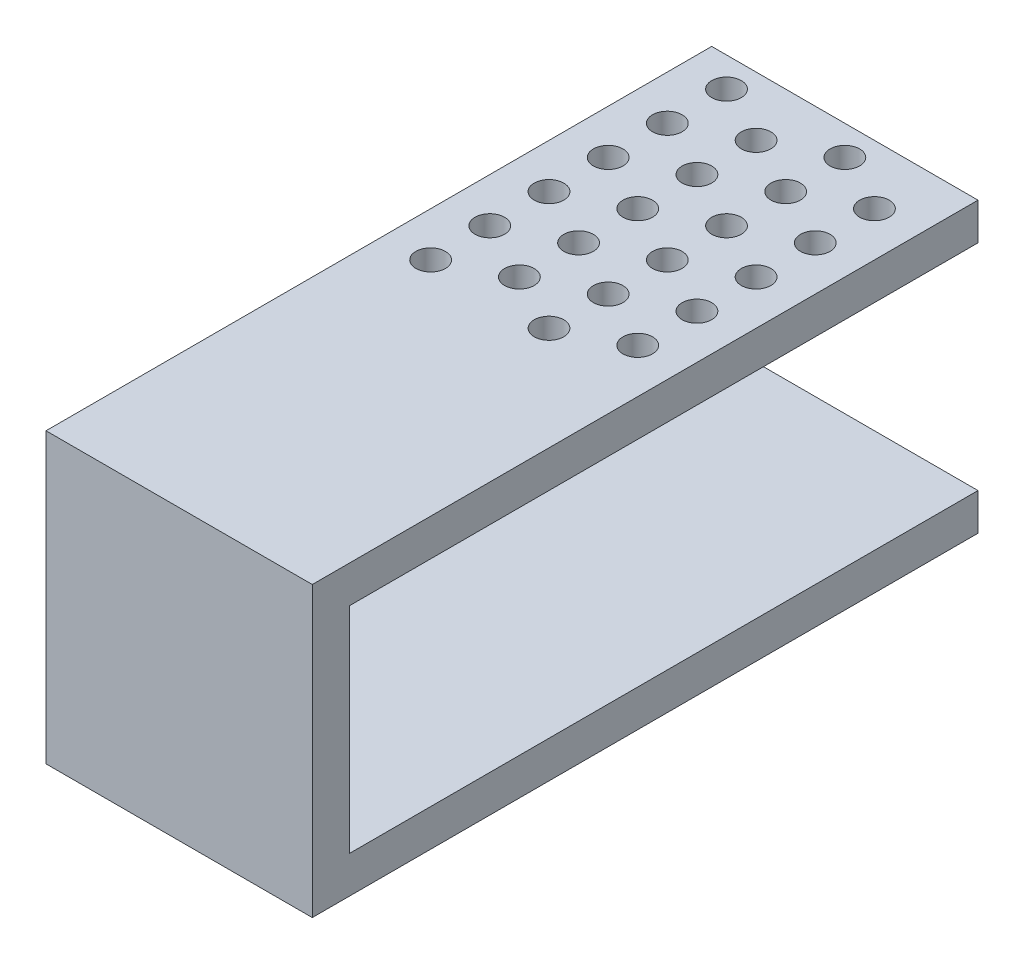
ISO-10303-21;
HEADER;
FILE_DESCRIPTION(('STEP AP214'),'2;1');
FILE_NAME('part.step','',(''),(''),'','','');
FILE_SCHEMA(('AUTOMOTIVE_DESIGN { 1 0 10303 214 1 1 1 1 }'));
ENDSEC;
DATA;
#1=APPLICATION_CONTEXT('core data for automotive mechanical design processes');
#2=APPLICATION_PROTOCOL_DEFINITION('international standard','automotive_design',2000,#1);
#3=PRODUCT_CONTEXT('',#1,'mechanical');
#4=PRODUCT('Part','Part','',(#3));
#5=PRODUCT_RELATED_PRODUCT_CATEGORY('part','',(#4));
#6=PRODUCT_DEFINITION_FORMATION('','',#4);
#7=PRODUCT_DEFINITION_CONTEXT('part definition',#1,'design');
#8=PRODUCT_DEFINITION('design','',#6,#7);
#9=PRODUCT_DEFINITION_SHAPE('','',#8);
#10=(LENGTH_UNIT() NAMED_UNIT(*) SI_UNIT(.MILLI.,.METRE.));
#11=(NAMED_UNIT(*) PLANE_ANGLE_UNIT() SI_UNIT($,.RADIAN.));
#12=(NAMED_UNIT(*) SI_UNIT($,.STERADIAN.) SOLID_ANGLE_UNIT());
#13=UNCERTAINTY_MEASURE_WITH_UNIT(LENGTH_MEASURE(1.E-05),#10,'distance_accuracy_value','');
#14=(GEOMETRIC_REPRESENTATION_CONTEXT(3) GLOBAL_UNCERTAINTY_ASSIGNED_CONTEXT((#13)) GLOBAL_UNIT_ASSIGNED_CONTEXT((#10,
#11,#12)) REPRESENTATION_CONTEXT('',''));
#15=CARTESIAN_POINT('',(0.,0.,0.));
#16=DIRECTION('',(0.,0.,1.));
#17=DIRECTION('',(1.,0.,0.));
#18=AXIS2_PLACEMENT_3D('',#15,#16,#17);
#19=CARTESIAN_POINT('',(-2.,-17.,26.5));
#20=DIRECTION('',(0.,0.,1.));
#21=DIRECTION('',(1.,0.,0.));
#22=AXIS2_PLACEMENT_3D('',#19,#20,#21);
#23=PLANE('',#22);
#24=DIRECTION('',(1.,0.,0.));
#25=VECTOR('',#24,1.);
#26=CARTESIAN_POINT('',(-2.,-14.5,26.5));
#27=LINE('',#26,#25);
#28=CARTESIAN_POINT('',(-20.,-14.5,26.5));
#29=VERTEX_POINT('',#28);
#30=CARTESIAN_POINT('',(-2.,-14.5,26.5));
#31=VERTEX_POINT('',#30);
#32=EDGE_CURVE('E257',#29,#31,#27,.T.);
#33=ORIENTED_EDGE('',*,*,#32,.F.);
#34=DIRECTION('',(0.,1.,0.));
#35=VECTOR('',#34,1.);
#36=CARTESIAN_POINT('',(-20.,-17.,26.5));
#37=LINE('',#36,#35);
#38=CARTESIAN_POINT('',(-20.,0.,26.5));
#39=VERTEX_POINT('',#38);
#40=EDGE_CURVE('E50',#29,#39,#37,.T.);
#41=ORIENTED_EDGE('',*,*,#40,.T.);
#42=DIRECTION('',(1.,0.,0.));
#43=VECTOR('',#42,1.);
#44=CARTESIAN_POINT('',(-2.,0.,26.5));
#45=LINE('',#44,#43);
#46=CARTESIAN_POINT('',(-2.,0.,26.5));
#47=VERTEX_POINT('',#46);
#48=EDGE_CURVE('E87',#39,#47,#45,.T.);
#49=ORIENTED_EDGE('',*,*,#48,.T.);
#50=DIRECTION('',(0.,1.,0.));
#51=VECTOR('',#50,1.);
#52=CARTESIAN_POINT('',(-2.,-17.,26.5));
#53=LINE('',#52,#51);
#54=EDGE_CURVE('E237',#31,#47,#53,.T.);
#55=ORIENTED_EDGE('',*,*,#54,.F.);
#56=EDGE_LOOP('',(#33,#41,#49,#55));
#57=FACE_BOUND('',#56,.T.);
#58=ADVANCED_FACE('F35',(#57),#23,.F.);
#59=CARTESIAN_POINT('',(0.,0.,0.));
#60=DIRECTION('',(0.,1.,0.));
#61=DIRECTION('',(0.,0.,1.));
#62=AXIS2_PLACEMENT_3D('',#59,#60,#61);
#63=PLANE('',#62);
#64=CARTESIAN_POINT('',(-5.,0.,-12.));
#65=DIRECTION('',(0.,1.,0.));
#66=DIRECTION('',(0.,0.,1.));
#67=AXIS2_PLACEMENT_3D('',#64,#65,#66);
#68=CIRCLE('',#67,1.);
#69=CARTESIAN_POINT('',(-5.,0.,-11.));
#70=VERTEX_POINT('',#69);
#71=EDGE_CURVE('E222',#70,#70,#68,.T.);
#72=ORIENTED_EDGE('',*,*,#71,.T.);
#73=EDGE_LOOP('',(#72));
#74=FACE_BOUND('',#73,.T.);
#75=CARTESIAN_POINT('',(-5.,0.,-8.));
#76=DIRECTION('',(0.,1.,0.));
#77=DIRECTION('',(0.,0.,1.));
#78=AXIS2_PLACEMENT_3D('',#75,#76,#77);
#79=CIRCLE('',#78,1.);
#80=CARTESIAN_POINT('',(-5.,0.,-7.));
#81=VERTEX_POINT('',#80);
#82=EDGE_CURVE('E216',#81,#81,#79,.T.);
#83=ORIENTED_EDGE('',*,*,#82,.T.);
#84=EDGE_LOOP('',(#83));
#85=FACE_BOUND('',#84,.T.);
#86=CARTESIAN_POINT('',(-5.,0.,-4.));
#87=DIRECTION('',(0.,1.,0.));
#88=DIRECTION('',(0.,0.,1.));
#89=AXIS2_PLACEMENT_3D('',#86,#87,#88);
#90=CIRCLE('',#89,1.);
#91=CARTESIAN_POINT('',(-5.,0.,-3.));
#92=VERTEX_POINT('',#91);
#93=EDGE_CURVE('E210',#92,#92,#90,.T.);
#94=ORIENTED_EDGE('',*,*,#93,.T.);
#95=EDGE_LOOP('',(#94));
#96=FACE_BOUND('',#95,.T.);
#97=CARTESIAN_POINT('',(-5.,0.,0.));
#98=DIRECTION('',(0.,1.,0.));
#99=DIRECTION('',(0.,0.,1.));
#100=AXIS2_PLACEMENT_3D('',#97,#98,#99);
#101=CIRCLE('',#100,1.);
#102=CARTESIAN_POINT('',(-5.,0.,1.));
#103=VERTEX_POINT('',#102);
#104=EDGE_CURVE('E204',#103,#103,#101,.T.);
#105=ORIENTED_EDGE('',*,*,#104,.T.);
#106=EDGE_LOOP('',(#105));
#107=FACE_BOUND('',#106,.T.);
#108=CARTESIAN_POINT('',(-5.,0.,4.));
#109=DIRECTION('',(0.,1.,0.));
#110=DIRECTION('',(0.,0.,1.));
#111=AXIS2_PLACEMENT_3D('',#108,#109,#110);
#112=CIRCLE('',#111,1.);
#113=CARTESIAN_POINT('',(-5.,0.,5.));
#114=VERTEX_POINT('',#113);
#115=EDGE_CURVE('E198',#114,#114,#112,.T.);
#116=ORIENTED_EDGE('',*,*,#115,.T.);
#117=EDGE_LOOP('',(#116));
#118=FACE_BOUND('',#117,.T.);
#119=CARTESIAN_POINT('',(-9.,0.,-14.));
#120=DIRECTION('',(0.,1.,0.));
#121=DIRECTION('',(0.,0.,1.));
#122=AXIS2_PLACEMENT_3D('',#119,#120,#121);
#123=CIRCLE('',#122,1.);
#124=CARTESIAN_POINT('',(-9.,0.,-13.));
#125=VERTEX_POINT('',#124);
#126=EDGE_CURVE('E192',#125,#125,#123,.T.);
#127=ORIENTED_EDGE('',*,*,#126,.T.);
#128=EDGE_LOOP('',(#127));
#129=FACE_BOUND('',#128,.T.);
#130=CARTESIAN_POINT('',(-9.,0.,-10.));
#131=DIRECTION('',(0.,1.,0.));
#132=DIRECTION('',(0.,0.,1.));
#133=AXIS2_PLACEMENT_3D('',#130,#131,#132);
#134=CIRCLE('',#133,1.);
#135=CARTESIAN_POINT('',(-9.,0.,-9.));
#136=VERTEX_POINT('',#135);
#137=EDGE_CURVE('E186',#136,#136,#134,.T.);
#138=ORIENTED_EDGE('',*,*,#137,.T.);
#139=EDGE_LOOP('',(#138));
#140=FACE_BOUND('',#139,.T.);
#141=CARTESIAN_POINT('',(-9.,0.,-6.));
#142=DIRECTION('',(0.,1.,0.));
#143=DIRECTION('',(0.,0.,1.));
#144=AXIS2_PLACEMENT_3D('',#141,#142,#143);
#145=CIRCLE('',#144,1.);
#146=CARTESIAN_POINT('',(-9.,0.,-5.));
#147=VERTEX_POINT('',#146);
#148=EDGE_CURVE('E180',#147,#147,#145,.T.);
#149=ORIENTED_EDGE('',*,*,#148,.T.);
#150=EDGE_LOOP('',(#149));
#151=FACE_BOUND('',#150,.T.);
#152=CARTESIAN_POINT('',(-9.,0.,-2.));
#153=DIRECTION('',(0.,1.,0.));
#154=DIRECTION('',(0.,0.,1.));
#155=AXIS2_PLACEMENT_3D('',#152,#153,#154);
#156=CIRCLE('',#155,1.);
#157=CARTESIAN_POINT('',(-9.,0.,-0.999999999999999));
#158=VERTEX_POINT('',#157);
#159=EDGE_CURVE('E174',#158,#158,#156,.T.);
#160=ORIENTED_EDGE('',*,*,#159,.T.);
#161=EDGE_LOOP('',(#160));
#162=FACE_BOUND('',#161,.T.);
#163=CARTESIAN_POINT('',(-9.,0.,2.));
#164=DIRECTION('',(0.,1.,0.));
#165=DIRECTION('',(0.,0.,1.));
#166=AXIS2_PLACEMENT_3D('',#163,#164,#165);
#167=CIRCLE('',#166,1.);
#168=CARTESIAN_POINT('',(-9.,0.,3.));
#169=VERTEX_POINT('',#168);
#170=EDGE_CURVE('E168',#169,#169,#167,.T.);
#171=ORIENTED_EDGE('',*,*,#170,.T.);
#172=EDGE_LOOP('',(#171));
#173=FACE_BOUND('',#172,.T.);
#174=CARTESIAN_POINT('',(-9.,0.,6.));
#175=DIRECTION('',(0.,1.,0.));
#176=DIRECTION('',(0.,0.,1.));
#177=AXIS2_PLACEMENT_3D('',#174,#175,#176);
#178=CIRCLE('',#177,1.);
#179=CARTESIAN_POINT('',(-9.,0.,7.));
#180=VERTEX_POINT('',#179);
#181=EDGE_CURVE('E162',#180,#180,#178,.T.);
#182=ORIENTED_EDGE('',*,*,#181,.T.);
#183=EDGE_LOOP('',(#182));
#184=FACE_BOUND('',#183,.T.);
#185=CARTESIAN_POINT('',(-13.,0.,-12.));
#186=DIRECTION('',(0.,1.,0.));
#187=DIRECTION('',(0.,0.,1.));
#188=AXIS2_PLACEMENT_3D('',#185,#186,#187);
#189=CIRCLE('',#188,1.);
#190=CARTESIAN_POINT('',(-13.,0.,-11.));
#191=VERTEX_POINT('',#190);
#192=EDGE_CURVE('E156',#191,#191,#189,.T.);
#193=ORIENTED_EDGE('',*,*,#192,.T.);
#194=EDGE_LOOP('',(#193));
#195=FACE_BOUND('',#194,.T.);
#196=CARTESIAN_POINT('',(-13.,0.,-8.));
#197=DIRECTION('',(0.,1.,0.));
#198=DIRECTION('',(0.,0.,1.));
#199=AXIS2_PLACEMENT_3D('',#196,#197,#198);
#200=CIRCLE('',#199,1.00000000000001);
#201=CARTESIAN_POINT('',(-13.,0.,-6.99999999999999));
#202=VERTEX_POINT('',#201);
#203=EDGE_CURVE('E150',#202,#202,#200,.T.);
#204=ORIENTED_EDGE('',*,*,#203,.T.);
#205=EDGE_LOOP('',(#204));
#206=FACE_BOUND('',#205,.T.);
#207=CARTESIAN_POINT('',(-13.,0.,-4.));
#208=DIRECTION('',(0.,1.,0.));
#209=DIRECTION('',(0.,0.,1.));
#210=AXIS2_PLACEMENT_3D('',#207,#208,#209);
#211=CIRCLE('',#210,1.);
#212=CARTESIAN_POINT('',(-13.,0.,-3.));
#213=VERTEX_POINT('',#212);
#214=EDGE_CURVE('E144',#213,#213,#211,.T.);
#215=ORIENTED_EDGE('',*,*,#214,.T.);
#216=EDGE_LOOP('',(#215));
#217=FACE_BOUND('',#216,.T.);
#218=CARTESIAN_POINT('',(-13.,0.,0.));
#219=DIRECTION('',(0.,1.,0.));
#220=DIRECTION('',(0.,0.,1.));
#221=AXIS2_PLACEMENT_3D('',#218,#219,#220);
#222=CIRCLE('',#221,1.);
#223=CARTESIAN_POINT('',(-13.,0.,1.));
#224=VERTEX_POINT('',#223);
#225=EDGE_CURVE('E138',#224,#224,#222,.T.);
#226=ORIENTED_EDGE('',*,*,#225,.T.);
#227=EDGE_LOOP('',(#226));
#228=FACE_BOUND('',#227,.T.);
#229=CARTESIAN_POINT('',(-13.,0.,4.));
#230=DIRECTION('',(0.,1.,0.));
#231=DIRECTION('',(0.,0.,1.));
#232=AXIS2_PLACEMENT_3D('',#229,#230,#231);
#233=CIRCLE('',#232,1.);
#234=CARTESIAN_POINT('',(-13.,0.,5.));
#235=VERTEX_POINT('',#234);
#236=EDGE_CURVE('E132',#235,#235,#233,.T.);
#237=ORIENTED_EDGE('',*,*,#236,.T.);
#238=EDGE_LOOP('',(#237));
#239=FACE_BOUND('',#238,.T.);
#240=CARTESIAN_POINT('',(-17.,0.,-14.));
#241=DIRECTION('',(0.,1.,0.));
#242=DIRECTION('',(0.,0.,1.));
#243=AXIS2_PLACEMENT_3D('',#240,#241,#242);
#244=CIRCLE('',#243,1.);
#245=CARTESIAN_POINT('',(-17.,0.,-13.));
#246=VERTEX_POINT('',#245);
#247=EDGE_CURVE('E126',#246,#246,#244,.T.);
#248=ORIENTED_EDGE('',*,*,#247,.T.);
#249=EDGE_LOOP('',(#248));
#250=FACE_BOUND('',#249,.T.);
#251=CARTESIAN_POINT('',(-17.,0.,-10.));
#252=DIRECTION('',(0.,1.,0.));
#253=DIRECTION('',(0.,0.,1.));
#254=AXIS2_PLACEMENT_3D('',#251,#252,#253);
#255=CIRCLE('',#254,1.);
#256=CARTESIAN_POINT('',(-17.,0.,-9.));
#257=VERTEX_POINT('',#256);
#258=EDGE_CURVE('E120',#257,#257,#255,.T.);
#259=ORIENTED_EDGE('',*,*,#258,.T.);
#260=EDGE_LOOP('',(#259));
#261=FACE_BOUND('',#260,.T.);
#262=CARTESIAN_POINT('',(-17.,0.,-6.));
#263=DIRECTION('',(0.,1.,0.));
#264=DIRECTION('',(0.,0.,1.));
#265=AXIS2_PLACEMENT_3D('',#262,#263,#264);
#266=CIRCLE('',#265,1.);
#267=CARTESIAN_POINT('',(-17.,0.,-5.));
#268=VERTEX_POINT('',#267);
#269=EDGE_CURVE('E114',#268,#268,#266,.T.);
#270=ORIENTED_EDGE('',*,*,#269,.T.);
#271=EDGE_LOOP('',(#270));
#272=FACE_BOUND('',#271,.T.);
#273=CARTESIAN_POINT('',(-17.,0.,-2.));
#274=DIRECTION('',(0.,1.,0.));
#275=DIRECTION('',(0.,0.,1.));
#276=AXIS2_PLACEMENT_3D('',#273,#274,#275);
#277=CIRCLE('',#276,1.);
#278=CARTESIAN_POINT('',(-17.,0.,-0.999999999999999));
#279=VERTEX_POINT('',#278);
#280=EDGE_CURVE('E108',#279,#279,#277,.T.);
#281=ORIENTED_EDGE('',*,*,#280,.T.);
#282=EDGE_LOOP('',(#281));
#283=FACE_BOUND('',#282,.T.);
#284=CARTESIAN_POINT('',(-17.,0.,2.));
#285=DIRECTION('',(0.,1.,0.));
#286=DIRECTION('',(0.,0.,1.));
#287=AXIS2_PLACEMENT_3D('',#284,#285,#286);
#288=CIRCLE('',#287,1.);
#289=CARTESIAN_POINT('',(-17.,0.,3.));
#290=VERTEX_POINT('',#289);
#291=EDGE_CURVE('E102',#290,#290,#288,.T.);
#292=ORIENTED_EDGE('',*,*,#291,.T.);
#293=EDGE_LOOP('',(#292));
#294=FACE_BOUND('',#293,.T.);
#295=CARTESIAN_POINT('',(-17.,0.,6.));
#296=DIRECTION('',(0.,1.,0.));
#297=DIRECTION('',(0.,0.,1.));
#298=AXIS2_PLACEMENT_3D('',#295,#296,#297);
#299=CIRCLE('',#298,1.);
#300=CARTESIAN_POINT('',(-17.,0.,7.));
#301=VERTEX_POINT('',#300);
#302=EDGE_CURVE('E92',#301,#301,#299,.T.);
#303=ORIENTED_EDGE('',*,*,#302,.T.);
#304=EDGE_LOOP('',(#303));
#305=FACE_BOUND('',#304,.T.);
#306=ORIENTED_EDGE('',*,*,#48,.F.);
#307=DIRECTION('',(0.,0.,1.));
#308=VECTOR('',#307,1.);
#309=CARTESIAN_POINT('',(-20.,0.,-16.));
#310=LINE('',#309,#308);
#311=CARTESIAN_POINT('',(-20.,0.,-16.));
#312=VERTEX_POINT('',#311);
#313=EDGE_CURVE('E84',#312,#39,#310,.T.);
#314=ORIENTED_EDGE('',*,*,#313,.F.);
#315=DIRECTION('',(-1.,0.,0.));
#316=VECTOR('',#315,1.);
#317=CARTESIAN_POINT('',(-20.,0.,-16.));
#318=LINE('',#317,#316);
#319=CARTESIAN_POINT('',(-2.,0.,-16.));
#320=VERTEX_POINT('',#319);
#321=EDGE_CURVE('E71',#320,#312,#318,.T.);
#322=ORIENTED_EDGE('',*,*,#321,.F.);
#323=DIRECTION('',(0.,0.,-1.));
#324=VECTOR('',#323,1.);
#325=CARTESIAN_POINT('',(-2.,0.,-16.));
#326=LINE('',#325,#324);
#327=EDGE_CURVE('E80',#47,#320,#326,.T.);
#328=ORIENTED_EDGE('',*,*,#327,.F.);
#329=EDGE_LOOP('',(#306,#314,#322,#328));
#330=FACE_BOUND('',#329,.T.);
#331=ADVANCED_FACE('F86',(#74,#85,#96,#107,#118,#129,#140,#151,#162,#173,#184,#195,#206,#217,
#228,#239,#250,#261,#272,#283,#294,#305,#330),#63,.F.);
#332=CARTESIAN_POINT('',(0.,2.5,0.));
#333=DIRECTION('',(0.,1.,0.));
#334=DIRECTION('',(0.,0.,1.));
#335=AXIS2_PLACEMENT_3D('',#332,#333,#334);
#336=PLANE('',#335);
#337=CARTESIAN_POINT('',(-5.,2.5,-8.));
#338=DIRECTION('',(0.,1.,0.));
#339=DIRECTION('',(0.,0.,1.));
#340=AXIS2_PLACEMENT_3D('',#337,#338,#339);
#341=CIRCLE('',#340,1.);
#342=CARTESIAN_POINT('',(-5.,2.5,-7.));
#343=VERTEX_POINT('',#342);
#344=EDGE_CURVE('E213',#343,#343,#341,.T.);
#345=ORIENTED_EDGE('',*,*,#344,.F.);
#346=EDGE_LOOP('',(#345));
#347=FACE_BOUND('',#346,.T.);
#348=CARTESIAN_POINT('',(-5.,2.5,0.));
#349=DIRECTION('',(0.,1.,0.));
#350=DIRECTION('',(0.,0.,1.));
#351=AXIS2_PLACEMENT_3D('',#348,#349,#350);
#352=CIRCLE('',#351,1.);
#353=CARTESIAN_POINT('',(-5.,2.5,1.));
#354=VERTEX_POINT('',#353);
#355=EDGE_CURVE('E201',#354,#354,#352,.T.);
#356=ORIENTED_EDGE('',*,*,#355,.F.);
#357=EDGE_LOOP('',(#356));
#358=FACE_BOUND('',#357,.T.);
#359=CARTESIAN_POINT('',(-9.,2.5,-14.));
#360=DIRECTION('',(0.,1.,0.));
#361=DIRECTION('',(0.,0.,1.));
#362=AXIS2_PLACEMENT_3D('',#359,#360,#361);
#363=CIRCLE('',#362,1.);
#364=CARTESIAN_POINT('',(-9.,2.5,-13.));
#365=VERTEX_POINT('',#364);
#366=EDGE_CURVE('E189',#365,#365,#363,.T.);
#367=ORIENTED_EDGE('',*,*,#366,.F.);
#368=EDGE_LOOP('',(#367));
#369=FACE_BOUND('',#368,.T.);
#370=CARTESIAN_POINT('',(-9.,2.5,-6.));
#371=DIRECTION('',(0.,1.,0.));
#372=DIRECTION('',(0.,0.,1.));
#373=AXIS2_PLACEMENT_3D('',#370,#371,#372);
#374=CIRCLE('',#373,1.);
#375=CARTESIAN_POINT('',(-9.,2.5,-5.));
#376=VERTEX_POINT('',#375);
#377=EDGE_CURVE('E177',#376,#376,#374,.T.);
#378=ORIENTED_EDGE('',*,*,#377,.F.);
#379=EDGE_LOOP('',(#378));
#380=FACE_BOUND('',#379,.T.);
#381=CARTESIAN_POINT('',(-9.,2.5,2.));
#382=DIRECTION('',(0.,1.,0.));
#383=DIRECTION('',(0.,0.,1.));
#384=AXIS2_PLACEMENT_3D('',#381,#382,#383);
#385=CIRCLE('',#384,1.);
#386=CARTESIAN_POINT('',(-9.,2.5,3.));
#387=VERTEX_POINT('',#386);
#388=EDGE_CURVE('E165',#387,#387,#385,.T.);
#389=ORIENTED_EDGE('',*,*,#388,.F.);
#390=EDGE_LOOP('',(#389));
#391=FACE_BOUND('',#390,.T.);
#392=CARTESIAN_POINT('',(-13.,2.5,-12.));
#393=DIRECTION('',(0.,1.,0.));
#394=DIRECTION('',(0.,0.,1.));
#395=AXIS2_PLACEMENT_3D('',#392,#393,#394);
#396=CIRCLE('',#395,1.);
#397=CARTESIAN_POINT('',(-13.,2.5,-11.));
#398=VERTEX_POINT('',#397);
#399=EDGE_CURVE('E153',#398,#398,#396,.T.);
#400=ORIENTED_EDGE('',*,*,#399,.F.);
#401=EDGE_LOOP('',(#400));
#402=FACE_BOUND('',#401,.T.);
#403=CARTESIAN_POINT('',(-13.,2.5,-4.));
#404=DIRECTION('',(0.,1.,0.));
#405=DIRECTION('',(0.,0.,1.));
#406=AXIS2_PLACEMENT_3D('',#403,#404,#405);
#407=CIRCLE('',#406,1.);
#408=CARTESIAN_POINT('',(-13.,2.5,-3.));
#409=VERTEX_POINT('',#408);
#410=EDGE_CURVE('E141',#409,#409,#407,.T.);
#411=ORIENTED_EDGE('',*,*,#410,.F.);
#412=EDGE_LOOP('',(#411));
#413=FACE_BOUND('',#412,.T.);
#414=CARTESIAN_POINT('',(-13.,2.5,4.));
#415=DIRECTION('',(0.,1.,0.));
#416=DIRECTION('',(0.,0.,1.));
#417=AXIS2_PLACEMENT_3D('',#414,#415,#416);
#418=CIRCLE('',#417,1.);
#419=CARTESIAN_POINT('',(-13.,2.5,5.));
#420=VERTEX_POINT('',#419);
#421=EDGE_CURVE('E129',#420,#420,#418,.T.);
#422=ORIENTED_EDGE('',*,*,#421,.F.);
#423=EDGE_LOOP('',(#422));
#424=FACE_BOUND('',#423,.T.);
#425=CARTESIAN_POINT('',(-17.,2.5,-10.));
#426=DIRECTION('',(0.,1.,0.));
#427=DIRECTION('',(0.,0.,1.));
#428=AXIS2_PLACEMENT_3D('',#425,#426,#427);
#429=CIRCLE('',#428,1.);
#430=CARTESIAN_POINT('',(-17.,2.5,-9.));
#431=VERTEX_POINT('',#430);
#432=EDGE_CURVE('E117',#431,#431,#429,.T.);
#433=ORIENTED_EDGE('',*,*,#432,.F.);
#434=EDGE_LOOP('',(#433));
#435=FACE_BOUND('',#434,.T.);
#436=CARTESIAN_POINT('',(-17.,2.5,-2.));
#437=DIRECTION('',(0.,1.,0.));
#438=DIRECTION('',(0.,0.,1.));
#439=AXIS2_PLACEMENT_3D('',#436,#437,#438);
#440=CIRCLE('',#439,1.);
#441=CARTESIAN_POINT('',(-17.,2.5,-0.999999999999999));
#442=VERTEX_POINT('',#441);
#443=EDGE_CURVE('E105',#442,#442,#440,.T.);
#444=ORIENTED_EDGE('',*,*,#443,.F.);
#445=EDGE_LOOP('',(#444));
#446=FACE_BOUND('',#445,.T.);
#447=CARTESIAN_POINT('',(-17.,2.5,6.));
#448=DIRECTION('',(0.,1.,0.));
#449=DIRECTION('',(0.,0.,1.));
#450=AXIS2_PLACEMENT_3D('',#447,#448,#449);
#451=CIRCLE('',#450,1.);
#452=CARTESIAN_POINT('',(-17.,2.5,7.));
#453=VERTEX_POINT('',#452);
#454=EDGE_CURVE('E88',#453,#453,#451,.T.);
#455=ORIENTED_EDGE('',*,*,#454,.F.);
#456=EDGE_LOOP('',(#455));
#457=FACE_BOUND('',#456,.T.);
#458=DIRECTION('',(0.,0.,1.));
#459=VECTOR('',#458,1.);
#460=CARTESIAN_POINT('',(-20.,2.5,-16.));
#461=LINE('',#460,#459);
#462=CARTESIAN_POINT('',(-20.,2.5,-16.));
#463=VERTEX_POINT('',#462);
#464=CARTESIAN_POINT('',(-20.,2.5,29.));
#465=VERTEX_POINT('',#464);
#466=EDGE_CURVE('E79',#463,#465,#461,.T.);
#467=ORIENTED_EDGE('',*,*,#466,.T.);
#468=DIRECTION('',(-1.,0.,0.));
#469=VECTOR('',#468,1.);
#470=CARTESIAN_POINT('',(-20.,2.5,29.));
#471=LINE('',#470,#469);
#472=CARTESIAN_POINT('',(-2.,2.5,29.));
#473=VERTEX_POINT('',#472);
#474=EDGE_CURVE('E225',#473,#465,#471,.T.);
#475=ORIENTED_EDGE('',*,*,#474,.F.);
#476=DIRECTION('',(0.,0.,-1.));
#477=VECTOR('',#476,1.);
#478=CARTESIAN_POINT('',(-2.,2.5,-16.));
#479=LINE('',#478,#477);
#480=CARTESIAN_POINT('',(-2.,2.5,-16.));
#481=VERTEX_POINT('',#480);
#482=EDGE_CURVE('E96',#473,#481,#479,.T.);
#483=ORIENTED_EDGE('',*,*,#482,.T.);
#484=DIRECTION('',(-1.,0.,0.));
#485=VECTOR('',#484,1.);
#486=CARTESIAN_POINT('',(-20.,2.5,-16.));
#487=LINE('',#486,#485);
#488=EDGE_CURVE('E59',#481,#463,#487,.T.);
#489=ORIENTED_EDGE('',*,*,#488,.T.);
#490=EDGE_LOOP('',(#467,#475,#483,#489));
#491=FACE_BOUND('',#490,.T.);
#492=CARTESIAN_POINT('',(-17.,2.5,2.));
#493=DIRECTION('',(0.,1.,0.));
#494=DIRECTION('',(0.,0.,1.));
#495=AXIS2_PLACEMENT_3D('',#492,#493,#494);
#496=CIRCLE('',#495,1.);
#497=CARTESIAN_POINT('',(-17.,2.5,3.));
#498=VERTEX_POINT('',#497);
#499=EDGE_CURVE('E100',#498,#498,#496,.T.);
#500=ORIENTED_EDGE('',*,*,#499,.F.);
#501=EDGE_LOOP('',(#500));
#502=FACE_BOUND('',#501,.T.);
#503=CARTESIAN_POINT('',(-17.,2.5,-6.));
#504=DIRECTION('',(0.,1.,0.));
#505=DIRECTION('',(0.,0.,1.));
#506=AXIS2_PLACEMENT_3D('',#503,#504,#505);
#507=CIRCLE('',#506,1.);
#508=CARTESIAN_POINT('',(-17.,2.5,-5.));
#509=VERTEX_POINT('',#508);
#510=EDGE_CURVE('E111',#509,#509,#507,.T.);
#511=ORIENTED_EDGE('',*,*,#510,.F.);
#512=EDGE_LOOP('',(#511));
#513=FACE_BOUND('',#512,.T.);
#514=CARTESIAN_POINT('',(-17.,2.5,-14.));
#515=DIRECTION('',(0.,1.,0.));
#516=DIRECTION('',(0.,0.,1.));
#517=AXIS2_PLACEMENT_3D('',#514,#515,#516);
#518=CIRCLE('',#517,1.);
#519=CARTESIAN_POINT('',(-17.,2.5,-13.));
#520=VERTEX_POINT('',#519);
#521=EDGE_CURVE('E123',#520,#520,#518,.T.);
#522=ORIENTED_EDGE('',*,*,#521,.F.);
#523=EDGE_LOOP('',(#522));
#524=FACE_BOUND('',#523,.T.);
#525=CARTESIAN_POINT('',(-13.,2.5,0.));
#526=DIRECTION('',(0.,1.,0.));
#527=DIRECTION('',(0.,0.,1.));
#528=AXIS2_PLACEMENT_3D('',#525,#526,#527);
#529=CIRCLE('',#528,1.);
#530=CARTESIAN_POINT('',(-13.,2.5,1.));
#531=VERTEX_POINT('',#530);
#532=EDGE_CURVE('E135',#531,#531,#529,.T.);
#533=ORIENTED_EDGE('',*,*,#532,.F.);
#534=EDGE_LOOP('',(#533));
#535=FACE_BOUND('',#534,.T.);
#536=CARTESIAN_POINT('',(-13.,2.5,-8.));
#537=DIRECTION('',(0.,1.,0.));
#538=DIRECTION('',(0.,0.,1.));
#539=AXIS2_PLACEMENT_3D('',#536,#537,#538);
#540=CIRCLE('',#539,1.00000000000001);
#541=CARTESIAN_POINT('',(-13.,2.5,-6.99999999999999));
#542=VERTEX_POINT('',#541);
#543=EDGE_CURVE('E147',#542,#542,#540,.T.);
#544=ORIENTED_EDGE('',*,*,#543,.F.);
#545=EDGE_LOOP('',(#544));
#546=FACE_BOUND('',#545,.T.);
#547=CARTESIAN_POINT('',(-9.,2.5,6.));
#548=DIRECTION('',(0.,1.,0.));
#549=DIRECTION('',(0.,0.,1.));
#550=AXIS2_PLACEMENT_3D('',#547,#548,#549);
#551=CIRCLE('',#550,1.);
#552=CARTESIAN_POINT('',(-9.,2.5,7.));
#553=VERTEX_POINT('',#552);
#554=EDGE_CURVE('E159',#553,#553,#551,.T.);
#555=ORIENTED_EDGE('',*,*,#554,.F.);
#556=EDGE_LOOP('',(#555));
#557=FACE_BOUND('',#556,.T.);
#558=CARTESIAN_POINT('',(-9.,2.5,-2.));
#559=DIRECTION('',(0.,1.,0.));
#560=DIRECTION('',(0.,0.,1.));
#561=AXIS2_PLACEMENT_3D('',#558,#559,#560);
#562=CIRCLE('',#561,1.);
#563=CARTESIAN_POINT('',(-9.,2.5,-0.999999999999999));
#564=VERTEX_POINT('',#563);
#565=EDGE_CURVE('E171',#564,#564,#562,.T.);
#566=ORIENTED_EDGE('',*,*,#565,.F.);
#567=EDGE_LOOP('',(#566));
#568=FACE_BOUND('',#567,.T.);
#569=CARTESIAN_POINT('',(-9.,2.5,-10.));
#570=DIRECTION('',(0.,1.,0.));
#571=DIRECTION('',(0.,0.,1.));
#572=AXIS2_PLACEMENT_3D('',#569,#570,#571);
#573=CIRCLE('',#572,1.);
#574=CARTESIAN_POINT('',(-9.,2.5,-9.));
#575=VERTEX_POINT('',#574);
#576=EDGE_CURVE('E183',#575,#575,#573,.T.);
#577=ORIENTED_EDGE('',*,*,#576,.F.);
#578=EDGE_LOOP('',(#577));
#579=FACE_BOUND('',#578,.T.);
#580=CARTESIAN_POINT('',(-5.,2.5,4.));
#581=DIRECTION('',(0.,1.,0.));
#582=DIRECTION('',(0.,0.,1.));
#583=AXIS2_PLACEMENT_3D('',#580,#581,#582);
#584=CIRCLE('',#583,1.);
#585=CARTESIAN_POINT('',(-5.,2.5,5.));
#586=VERTEX_POINT('',#585);
#587=EDGE_CURVE('E195',#586,#586,#584,.T.);
#588=ORIENTED_EDGE('',*,*,#587,.F.);
#589=EDGE_LOOP('',(#588));
#590=FACE_BOUND('',#589,.T.);
#591=CARTESIAN_POINT('',(-5.,2.5,-4.));
#592=DIRECTION('',(0.,1.,0.));
#593=DIRECTION('',(0.,0.,1.));
#594=AXIS2_PLACEMENT_3D('',#591,#592,#593);
#595=CIRCLE('',#594,1.);
#596=CARTESIAN_POINT('',(-5.,2.5,-3.));
#597=VERTEX_POINT('',#596);
#598=EDGE_CURVE('E207',#597,#597,#595,.T.);
#599=ORIENTED_EDGE('',*,*,#598,.F.);
#600=EDGE_LOOP('',(#599));
#601=FACE_BOUND('',#600,.T.);
#602=CARTESIAN_POINT('',(-5.,2.5,-12.));
#603=DIRECTION('',(0.,1.,0.));
#604=DIRECTION('',(0.,0.,1.));
#605=AXIS2_PLACEMENT_3D('',#602,#603,#604);
#606=CIRCLE('',#605,1.);
#607=CARTESIAN_POINT('',(-5.,2.5,-11.));
#608=VERTEX_POINT('',#607);
#609=EDGE_CURVE('E219',#608,#608,#606,.T.);
#610=ORIENTED_EDGE('',*,*,#609,.F.);
#611=EDGE_LOOP('',(#610));
#612=FACE_BOUND('',#611,.T.);
#613=ADVANCED_FACE('F304',(#347,#358,#369,#380,#391,#402,#413,#424,#435,#446,#457,#491,#502,
#513,#524,#535,#546,#557,#568,#579,#590,#601,#612),#336,.T.);
#614=CARTESIAN_POINT('',(-20.,2.5,-16.));
#615=DIRECTION('',(1.,0.,0.));
#616=DIRECTION('',(0.,0.,-1.));
#617=AXIS2_PLACEMENT_3D('',#614,#615,#616);
#618=PLANE('',#617);
#619=ORIENTED_EDGE('',*,*,#313,.T.);
#620=ORIENTED_EDGE('',*,*,#40,.F.);
#621=DIRECTION('',(0.,0.,1.));
#622=VECTOR('',#621,1.);
#623=CARTESIAN_POINT('',(-20.,-14.5,-16.));
#624=LINE('',#623,#622);
#625=CARTESIAN_POINT('',(-20.,-14.5,-16.));
#626=VERTEX_POINT('',#625);
#627=EDGE_CURVE('E243',#626,#29,#624,.T.);
#628=ORIENTED_EDGE('',*,*,#627,.F.);
#629=DIRECTION('',(0.,1.,0.));
#630=VECTOR('',#629,1.);
#631=CARTESIAN_POINT('',(-20.,-17.,-16.));
#632=LINE('',#631,#630);
#633=CARTESIAN_POINT('',(-20.,-17.,-16.));
#634=VERTEX_POINT('',#633);
#635=EDGE_CURVE('E263',#634,#626,#632,.T.);
#636=ORIENTED_EDGE('',*,*,#635,.F.);
#637=DIRECTION('',(0.,0.,-1.));
#638=VECTOR('',#637,1.);
#639=CARTESIAN_POINT('',(-20.,-17.,29.));
#640=LINE('',#639,#638);
#641=CARTESIAN_POINT('',(-20.,-17.,29.));
#642=VERTEX_POINT('',#641);
#643=EDGE_CURVE('E240',#642,#634,#640,.T.);
#644=ORIENTED_EDGE('',*,*,#643,.F.);
#645=DIRECTION('',(0.,-1.,0.));
#646=VECTOR('',#645,1.);
#647=CARTESIAN_POINT('',(-20.,2.5,29.));
#648=LINE('',#647,#646);
#649=EDGE_CURVE('E233',#465,#642,#648,.T.);
#650=ORIENTED_EDGE('',*,*,#649,.F.);
#651=ORIENTED_EDGE('',*,*,#466,.F.);
#652=DIRECTION('',(0.,-1.,0.));
#653=VECTOR('',#652,1.);
#654=CARTESIAN_POINT('',(-20.,2.5,-16.));
#655=LINE('',#654,#653);
#656=EDGE_CURVE('E43',#463,#312,#655,.T.);
#657=ORIENTED_EDGE('',*,*,#656,.T.);
#658=EDGE_LOOP('',(#619,#620,#628,#636,#644,#650,#651,#657));
#659=FACE_BOUND('',#658,.T.);
#660=ADVANCED_FACE('F37',(#659),#618,.F.);
#661=CARTESIAN_POINT('',(-2.,2.5,-16.));
#662=DIRECTION('',(-1.,0.,0.));
#663=DIRECTION('',(0.,0.,1.));
#664=AXIS2_PLACEMENT_3D('',#661,#662,#663);
#665=PLANE('',#664);
#666=DIRECTION('',(0.,1.,0.));
#667=VECTOR('',#666,1.);
#668=CARTESIAN_POINT('',(-2.,2.5,29.));
#669=LINE('',#668,#667);
#670=CARTESIAN_POINT('',(-2.,-17.,29.));
#671=VERTEX_POINT('',#670);
#672=EDGE_CURVE('E230',#671,#473,#669,.T.);
#673=ORIENTED_EDGE('',*,*,#672,.F.);
#674=DIRECTION('',(0.,0.,1.));
#675=VECTOR('',#674,1.);
#676=CARTESIAN_POINT('',(-2.,-17.,29.));
#677=LINE('',#676,#675);
#678=CARTESIAN_POINT('',(-2.,-17.,-16.));
#679=VERTEX_POINT('',#678);
#680=EDGE_CURVE('E242',#679,#671,#677,.T.);
#681=ORIENTED_EDGE('',*,*,#680,.F.);
#682=DIRECTION('',(0.,-1.,0.));
#683=VECTOR('',#682,1.);
#684=CARTESIAN_POINT('',(-2.,-17.,-16.));
#685=LINE('',#684,#683);
#686=CARTESIAN_POINT('',(-2.,-14.5,-16.));
#687=VERTEX_POINT('',#686);
#688=EDGE_CURVE('E260',#687,#679,#685,.T.);
#689=ORIENTED_EDGE('',*,*,#688,.F.);
#690=DIRECTION('',(0.,0.,1.));
#691=VECTOR('',#690,1.);
#692=CARTESIAN_POINT('',(-2.,-14.5,-16.));
#693=LINE('',#692,#691);
#694=EDGE_CURVE('E253',#687,#31,#693,.T.);
#695=ORIENTED_EDGE('',*,*,#694,.T.);
#696=ORIENTED_EDGE('',*,*,#54,.T.);
#697=ORIENTED_EDGE('',*,*,#327,.T.);
#698=DIRECTION('',(0.,-1.,0.));
#699=VECTOR('',#698,1.);
#700=CARTESIAN_POINT('',(-2.,2.5,-16.));
#701=LINE('',#700,#699);
#702=EDGE_CURVE('E11',#481,#320,#701,.T.);
#703=ORIENTED_EDGE('',*,*,#702,.F.);
#704=ORIENTED_EDGE('',*,*,#482,.F.);
#705=EDGE_LOOP('',(#673,#681,#689,#695,#696,#697,#703,#704));
#706=FACE_BOUND('',#705,.T.);
#707=ADVANCED_FACE('F285',(#706),#665,.F.);
#708=CARTESIAN_POINT('',(-20.,2.5,-16.));
#709=DIRECTION('',(0.,0.,1.));
#710=DIRECTION('',(1.,0.,0.));
#711=AXIS2_PLACEMENT_3D('',#708,#709,#710);
#712=PLANE('',#711);
#713=ORIENTED_EDGE('',*,*,#321,.T.);
#714=ORIENTED_EDGE('',*,*,#656,.F.);
#715=ORIENTED_EDGE('',*,*,#488,.F.);
#716=ORIENTED_EDGE('',*,*,#702,.T.);
#717=EDGE_LOOP('',(#713,#714,#715,#716));
#718=FACE_BOUND('',#717,.T.);
#719=ADVANCED_FACE('F73',(#718),#712,.F.);
#720=CARTESIAN_POINT('',(-17.,2.5,6.));
#721=DIRECTION('',(0.,-1.,0.));
#722=DIRECTION('',(0.,0.,-1.));
#723=AXIS2_PLACEMENT_3D('',#720,#721,#722);
#724=CYLINDRICAL_SURFACE('',#723,1.);
#725=ORIENTED_EDGE('',*,*,#454,.T.);
#726=EDGE_LOOP('',(#725));
#727=FACE_BOUND('',#726,.T.);
#728=ORIENTED_EDGE('',*,*,#302,.F.);
#729=EDGE_LOOP('',(#728));
#730=FACE_BOUND('',#729,.T.);
#731=ADVANCED_FACE('F414',(#727,#730),#724,.F.);
#732=CARTESIAN_POINT('',(-17.,2.5,2.));
#733=DIRECTION('',(0.,-1.,0.));
#734=DIRECTION('',(0.,0.,-1.));
#735=AXIS2_PLACEMENT_3D('',#732,#733,#734);
#736=CYLINDRICAL_SURFACE('',#735,1.);
#737=ORIENTED_EDGE('',*,*,#499,.T.);
#738=EDGE_LOOP('',(#737));
#739=FACE_BOUND('',#738,.T.);
#740=ORIENTED_EDGE('',*,*,#291,.F.);
#741=EDGE_LOOP('',(#740));
#742=FACE_BOUND('',#741,.T.);
#743=ADVANCED_FACE('F410',(#739,#742),#736,.F.);
#744=CARTESIAN_POINT('',(-17.,2.5,-2.));
#745=DIRECTION('',(0.,-1.,0.));
#746=DIRECTION('',(0.,0.,-1.));
#747=AXIS2_PLACEMENT_3D('',#744,#745,#746);
#748=CYLINDRICAL_SURFACE('',#747,1.);
#749=ORIENTED_EDGE('',*,*,#443,.T.);
#750=EDGE_LOOP('',(#749));
#751=FACE_BOUND('',#750,.T.);
#752=ORIENTED_EDGE('',*,*,#280,.F.);
#753=EDGE_LOOP('',(#752));
#754=FACE_BOUND('',#753,.T.);
#755=ADVANCED_FACE('F406',(#751,#754),#748,.F.);
#756=CARTESIAN_POINT('',(-17.,2.5,-6.));
#757=DIRECTION('',(0.,-1.,0.));
#758=DIRECTION('',(0.,0.,-1.));
#759=AXIS2_PLACEMENT_3D('',#756,#757,#758);
#760=CYLINDRICAL_SURFACE('',#759,1.);
#761=ORIENTED_EDGE('',*,*,#510,.T.);
#762=EDGE_LOOP('',(#761));
#763=FACE_BOUND('',#762,.T.);
#764=ORIENTED_EDGE('',*,*,#269,.F.);
#765=EDGE_LOOP('',(#764));
#766=FACE_BOUND('',#765,.T.);
#767=ADVANCED_FACE('F402',(#763,#766),#760,.F.);
#768=CARTESIAN_POINT('',(-17.,2.5,-10.));
#769=DIRECTION('',(0.,-1.,0.));
#770=DIRECTION('',(0.,0.,-1.));
#771=AXIS2_PLACEMENT_3D('',#768,#769,#770);
#772=CYLINDRICAL_SURFACE('',#771,1.);
#773=ORIENTED_EDGE('',*,*,#432,.T.);
#774=EDGE_LOOP('',(#773));
#775=FACE_BOUND('',#774,.T.);
#776=ORIENTED_EDGE('',*,*,#258,.F.);
#777=EDGE_LOOP('',(#776));
#778=FACE_BOUND('',#777,.T.);
#779=ADVANCED_FACE('F398',(#775,#778),#772,.F.);
#780=CARTESIAN_POINT('',(-17.,2.5,-14.));
#781=DIRECTION('',(0.,-1.,0.));
#782=DIRECTION('',(0.,0.,-1.));
#783=AXIS2_PLACEMENT_3D('',#780,#781,#782);
#784=CYLINDRICAL_SURFACE('',#783,1.);
#785=ORIENTED_EDGE('',*,*,#521,.T.);
#786=EDGE_LOOP('',(#785));
#787=FACE_BOUND('',#786,.T.);
#788=ORIENTED_EDGE('',*,*,#247,.F.);
#789=EDGE_LOOP('',(#788));
#790=FACE_BOUND('',#789,.T.);
#791=ADVANCED_FACE('F394',(#787,#790),#784,.F.);
#792=CARTESIAN_POINT('',(-13.,2.5,4.));
#793=DIRECTION('',(0.,-1.,0.));
#794=DIRECTION('',(0.,0.,-1.));
#795=AXIS2_PLACEMENT_3D('',#792,#793,#794);
#796=CYLINDRICAL_SURFACE('',#795,1.);
#797=ORIENTED_EDGE('',*,*,#421,.T.);
#798=EDGE_LOOP('',(#797));
#799=FACE_BOUND('',#798,.T.);
#800=ORIENTED_EDGE('',*,*,#236,.F.);
#801=EDGE_LOOP('',(#800));
#802=FACE_BOUND('',#801,.T.);
#803=ADVANCED_FACE('F390',(#799,#802),#796,.F.);
#804=CARTESIAN_POINT('',(-13.,2.5,0.));
#805=DIRECTION('',(0.,-1.,0.));
#806=DIRECTION('',(0.,0.,-1.));
#807=AXIS2_PLACEMENT_3D('',#804,#805,#806);
#808=CYLINDRICAL_SURFACE('',#807,1.);
#809=ORIENTED_EDGE('',*,*,#532,.T.);
#810=EDGE_LOOP('',(#809));
#811=FACE_BOUND('',#810,.T.);
#812=ORIENTED_EDGE('',*,*,#225,.F.);
#813=EDGE_LOOP('',(#812));
#814=FACE_BOUND('',#813,.T.);
#815=ADVANCED_FACE('F386',(#811,#814),#808,.F.);
#816=CARTESIAN_POINT('',(-13.,2.5,-4.));
#817=DIRECTION('',(0.,-1.,0.));
#818=DIRECTION('',(0.,0.,-1.));
#819=AXIS2_PLACEMENT_3D('',#816,#817,#818);
#820=CYLINDRICAL_SURFACE('',#819,1.);
#821=ORIENTED_EDGE('',*,*,#410,.T.);
#822=EDGE_LOOP('',(#821));
#823=FACE_BOUND('',#822,.T.);
#824=ORIENTED_EDGE('',*,*,#214,.F.);
#825=EDGE_LOOP('',(#824));
#826=FACE_BOUND('',#825,.T.);
#827=ADVANCED_FACE('F382',(#823,#826),#820,.F.);
#828=CARTESIAN_POINT('',(-13.,2.5,-8.));
#829=DIRECTION('',(0.,-1.,0.));
#830=DIRECTION('',(0.,0.,-1.));
#831=AXIS2_PLACEMENT_3D('',#828,#829,#830);
#832=CYLINDRICAL_SURFACE('',#831,1.00000000000001);
#833=ORIENTED_EDGE('',*,*,#543,.T.);
#834=EDGE_LOOP('',(#833));
#835=FACE_BOUND('',#834,.T.);
#836=ORIENTED_EDGE('',*,*,#203,.F.);
#837=EDGE_LOOP('',(#836));
#838=FACE_BOUND('',#837,.T.);
#839=ADVANCED_FACE('F378',(#835,#838),#832,.F.);
#840=CARTESIAN_POINT('',(-13.,2.5,-12.));
#841=DIRECTION('',(0.,-1.,0.));
#842=DIRECTION('',(0.,0.,-1.));
#843=AXIS2_PLACEMENT_3D('',#840,#841,#842);
#844=CYLINDRICAL_SURFACE('',#843,1.);
#845=ORIENTED_EDGE('',*,*,#399,.T.);
#846=EDGE_LOOP('',(#845));
#847=FACE_BOUND('',#846,.T.);
#848=ORIENTED_EDGE('',*,*,#192,.F.);
#849=EDGE_LOOP('',(#848));
#850=FACE_BOUND('',#849,.T.);
#851=ADVANCED_FACE('F374',(#847,#850),#844,.F.);
#852=CARTESIAN_POINT('',(-9.,2.5,6.));
#853=DIRECTION('',(0.,-1.,0.));
#854=DIRECTION('',(0.,0.,-1.));
#855=AXIS2_PLACEMENT_3D('',#852,#853,#854);
#856=CYLINDRICAL_SURFACE('',#855,1.);
#857=ORIENTED_EDGE('',*,*,#554,.T.);
#858=EDGE_LOOP('',(#857));
#859=FACE_BOUND('',#858,.T.);
#860=ORIENTED_EDGE('',*,*,#181,.F.);
#861=EDGE_LOOP('',(#860));
#862=FACE_BOUND('',#861,.T.);
#863=ADVANCED_FACE('F370',(#859,#862),#856,.F.);
#864=CARTESIAN_POINT('',(-9.,2.5,2.));
#865=DIRECTION('',(0.,-1.,0.));
#866=DIRECTION('',(0.,0.,-1.));
#867=AXIS2_PLACEMENT_3D('',#864,#865,#866);
#868=CYLINDRICAL_SURFACE('',#867,1.);
#869=ORIENTED_EDGE('',*,*,#388,.T.);
#870=EDGE_LOOP('',(#869));
#871=FACE_BOUND('',#870,.T.);
#872=ORIENTED_EDGE('',*,*,#170,.F.);
#873=EDGE_LOOP('',(#872));
#874=FACE_BOUND('',#873,.T.);
#875=ADVANCED_FACE('F366',(#871,#874),#868,.F.);
#876=CARTESIAN_POINT('',(-9.,2.5,-2.));
#877=DIRECTION('',(0.,-1.,0.));
#878=DIRECTION('',(0.,0.,-1.));
#879=AXIS2_PLACEMENT_3D('',#876,#877,#878);
#880=CYLINDRICAL_SURFACE('',#879,1.);
#881=ORIENTED_EDGE('',*,*,#565,.T.);
#882=EDGE_LOOP('',(#881));
#883=FACE_BOUND('',#882,.T.);
#884=ORIENTED_EDGE('',*,*,#159,.F.);
#885=EDGE_LOOP('',(#884));
#886=FACE_BOUND('',#885,.T.);
#887=ADVANCED_FACE('F362',(#883,#886),#880,.F.);
#888=CARTESIAN_POINT('',(-9.,2.5,-6.));
#889=DIRECTION('',(0.,-1.,0.));
#890=DIRECTION('',(0.,0.,-1.));
#891=AXIS2_PLACEMENT_3D('',#888,#889,#890);
#892=CYLINDRICAL_SURFACE('',#891,1.);
#893=ORIENTED_EDGE('',*,*,#377,.T.);
#894=EDGE_LOOP('',(#893));
#895=FACE_BOUND('',#894,.T.);
#896=ORIENTED_EDGE('',*,*,#148,.F.);
#897=EDGE_LOOP('',(#896));
#898=FACE_BOUND('',#897,.T.);
#899=ADVANCED_FACE('F358',(#895,#898),#892,.F.);
#900=CARTESIAN_POINT('',(-9.,2.5,-10.));
#901=DIRECTION('',(0.,-1.,0.));
#902=DIRECTION('',(0.,0.,-1.));
#903=AXIS2_PLACEMENT_3D('',#900,#901,#902);
#904=CYLINDRICAL_SURFACE('',#903,1.);
#905=ORIENTED_EDGE('',*,*,#576,.T.);
#906=EDGE_LOOP('',(#905));
#907=FACE_BOUND('',#906,.T.);
#908=ORIENTED_EDGE('',*,*,#137,.F.);
#909=EDGE_LOOP('',(#908));
#910=FACE_BOUND('',#909,.T.);
#911=ADVANCED_FACE('F354',(#907,#910),#904,.F.);
#912=CARTESIAN_POINT('',(-9.,2.5,-14.));
#913=DIRECTION('',(0.,-1.,0.));
#914=DIRECTION('',(0.,0.,-1.));
#915=AXIS2_PLACEMENT_3D('',#912,#913,#914);
#916=CYLINDRICAL_SURFACE('',#915,1.);
#917=ORIENTED_EDGE('',*,*,#366,.T.);
#918=EDGE_LOOP('',(#917));
#919=FACE_BOUND('',#918,.T.);
#920=ORIENTED_EDGE('',*,*,#126,.F.);
#921=EDGE_LOOP('',(#920));
#922=FACE_BOUND('',#921,.T.);
#923=ADVANCED_FACE('F350',(#919,#922),#916,.F.);
#924=CARTESIAN_POINT('',(-5.,2.5,4.));
#925=DIRECTION('',(0.,-1.,0.));
#926=DIRECTION('',(0.,0.,-1.));
#927=AXIS2_PLACEMENT_3D('',#924,#925,#926);
#928=CYLINDRICAL_SURFACE('',#927,1.);
#929=ORIENTED_EDGE('',*,*,#587,.T.);
#930=EDGE_LOOP('',(#929));
#931=FACE_BOUND('',#930,.T.);
#932=ORIENTED_EDGE('',*,*,#115,.F.);
#933=EDGE_LOOP('',(#932));
#934=FACE_BOUND('',#933,.T.);
#935=ADVANCED_FACE('F346',(#931,#934),#928,.F.);
#936=CARTESIAN_POINT('',(-5.,2.5,0.));
#937=DIRECTION('',(0.,-1.,0.));
#938=DIRECTION('',(0.,0.,-1.));
#939=AXIS2_PLACEMENT_3D('',#936,#937,#938);
#940=CYLINDRICAL_SURFACE('',#939,1.);
#941=ORIENTED_EDGE('',*,*,#355,.T.);
#942=EDGE_LOOP('',(#941));
#943=FACE_BOUND('',#942,.T.);
#944=ORIENTED_EDGE('',*,*,#104,.F.);
#945=EDGE_LOOP('',(#944));
#946=FACE_BOUND('',#945,.T.);
#947=ADVANCED_FACE('F342',(#943,#946),#940,.F.);
#948=CARTESIAN_POINT('',(-5.,2.5,-4.));
#949=DIRECTION('',(0.,-1.,0.));
#950=DIRECTION('',(0.,0.,-1.));
#951=AXIS2_PLACEMENT_3D('',#948,#949,#950);
#952=CYLINDRICAL_SURFACE('',#951,1.);
#953=ORIENTED_EDGE('',*,*,#598,.T.);
#954=EDGE_LOOP('',(#953));
#955=FACE_BOUND('',#954,.T.);
#956=ORIENTED_EDGE('',*,*,#93,.F.);
#957=EDGE_LOOP('',(#956));
#958=FACE_BOUND('',#957,.T.);
#959=ADVANCED_FACE('F338',(#955,#958),#952,.F.);
#960=CARTESIAN_POINT('',(-5.,2.5,-8.));
#961=DIRECTION('',(0.,-1.,0.));
#962=DIRECTION('',(0.,0.,-1.));
#963=AXIS2_PLACEMENT_3D('',#960,#961,#962);
#964=CYLINDRICAL_SURFACE('',#963,1.);
#965=ORIENTED_EDGE('',*,*,#344,.T.);
#966=EDGE_LOOP('',(#965));
#967=FACE_BOUND('',#966,.T.);
#968=ORIENTED_EDGE('',*,*,#82,.F.);
#969=EDGE_LOOP('',(#968));
#970=FACE_BOUND('',#969,.T.);
#971=ADVANCED_FACE('F334',(#967,#970),#964,.F.);
#972=CARTESIAN_POINT('',(-5.,2.5,-12.));
#973=DIRECTION('',(0.,-1.,0.));
#974=DIRECTION('',(0.,0.,-1.));
#975=AXIS2_PLACEMENT_3D('',#972,#973,#974);
#976=CYLINDRICAL_SURFACE('',#975,1.);
#977=ORIENTED_EDGE('',*,*,#609,.T.);
#978=EDGE_LOOP('',(#977));
#979=FACE_BOUND('',#978,.T.);
#980=ORIENTED_EDGE('',*,*,#71,.F.);
#981=EDGE_LOOP('',(#980));
#982=FACE_BOUND('',#981,.T.);
#983=ADVANCED_FACE('F322',(#979,#982),#976,.F.);
#984=CARTESIAN_POINT('',(0.,0.,29.));
#985=DIRECTION('',(0.,0.,1.));
#986=DIRECTION('',(1.,0.,0.));
#987=AXIS2_PLACEMENT_3D('',#984,#985,#986);
#988=PLANE('',#987);
#989=ORIENTED_EDGE('',*,*,#649,.T.);
#990=DIRECTION('',(-1.,0.,0.));
#991=VECTOR('',#990,1.);
#992=CARTESIAN_POINT('',(-2.,-17.,29.));
#993=LINE('',#992,#991);
#994=EDGE_CURVE('E246',#671,#642,#993,.T.);
#995=ORIENTED_EDGE('',*,*,#994,.F.);
#996=ORIENTED_EDGE('',*,*,#672,.T.);
#997=ORIENTED_EDGE('',*,*,#474,.T.);
#998=EDGE_LOOP('',(#989,#995,#996,#997));
#999=FACE_BOUND('',#998,.T.);
#1000=ADVANCED_FACE('F307',(#999),#988,.T.);
#1001=CARTESIAN_POINT('',(0.,-17.,0.));
#1002=DIRECTION('',(0.,1.,0.));
#1003=DIRECTION('',(0.,0.,1.));
#1004=AXIS2_PLACEMENT_3D('',#1001,#1002,#1003);
#1005=PLANE('',#1004);
#1006=ORIENTED_EDGE('',*,*,#680,.T.);
#1007=ORIENTED_EDGE('',*,*,#994,.T.);
#1008=ORIENTED_EDGE('',*,*,#643,.T.);
#1009=DIRECTION('',(-1.,0.,0.));
#1010=VECTOR('',#1009,1.);
#1011=CARTESIAN_POINT('',(-2.,-17.,-16.));
#1012=LINE('',#1011,#1010);
#1013=EDGE_CURVE('E266',#679,#634,#1012,.T.);
#1014=ORIENTED_EDGE('',*,*,#1013,.F.);
#1015=EDGE_LOOP('',(#1006,#1007,#1008,#1014));
#1016=FACE_BOUND('',#1015,.T.);
#1017=ADVANCED_FACE('F312',(#1016),#1005,.F.);
#1018=CARTESIAN_POINT('',(-2.,-14.5,-16.));
#1019=DIRECTION('',(0.,-1.,0.));
#1020=DIRECTION('',(0.,0.,-1.));
#1021=AXIS2_PLACEMENT_3D('',#1018,#1019,#1020);
#1022=PLANE('',#1021);
#1023=ORIENTED_EDGE('',*,*,#32,.T.);
#1024=ORIENTED_EDGE('',*,*,#694,.F.);
#1025=DIRECTION('',(1.,0.,0.));
#1026=VECTOR('',#1025,1.);
#1027=CARTESIAN_POINT('',(-2.,-14.5,-16.));
#1028=LINE('',#1027,#1026);
#1029=EDGE_CURVE('E256',#626,#687,#1028,.T.);
#1030=ORIENTED_EDGE('',*,*,#1029,.F.);
#1031=ORIENTED_EDGE('',*,*,#627,.T.);
#1032=EDGE_LOOP('',(#1023,#1024,#1030,#1031));
#1033=FACE_BOUND('',#1032,.T.);
#1034=ADVANCED_FACE('F314',(#1033),#1022,.F.);
#1035=CARTESIAN_POINT('',(0.,0.,-16.));
#1036=DIRECTION('',(0.,0.,1.));
#1037=DIRECTION('',(1.,0.,0.));
#1038=AXIS2_PLACEMENT_3D('',#1035,#1036,#1037);
#1039=PLANE('',#1038);
#1040=ORIENTED_EDGE('',*,*,#688,.T.);
#1041=ORIENTED_EDGE('',*,*,#1013,.T.);
#1042=ORIENTED_EDGE('',*,*,#635,.T.);
#1043=ORIENTED_EDGE('',*,*,#1029,.T.);
#1044=EDGE_LOOP('',(#1040,#1041,#1042,#1043));
#1045=FACE_BOUND('',#1044,.T.);
#1046=ADVANCED_FACE('F273',(#1045),#1039,.F.);
#1047=CLOSED_SHELL('',(#58,#331,#613,#660,#707,#719,#731,#743,#755,#767,#779,#791,#803,#815,
#827,#839,#851,#863,#875,#887,#899,#911,#923,#935,#947,#959,#971,#983,#1000,#1017,#1034,#1046));
#1048=MANIFOLD_SOLID_BREP('B2',#1047);
#1049=ADVANCED_BREP_SHAPE_REPRESENTATION('',(#18,#1048),#14);
#1050=SHAPE_DEFINITION_REPRESENTATION(#9,#1049);
ENDSEC;
END-ISO-10303-21;
